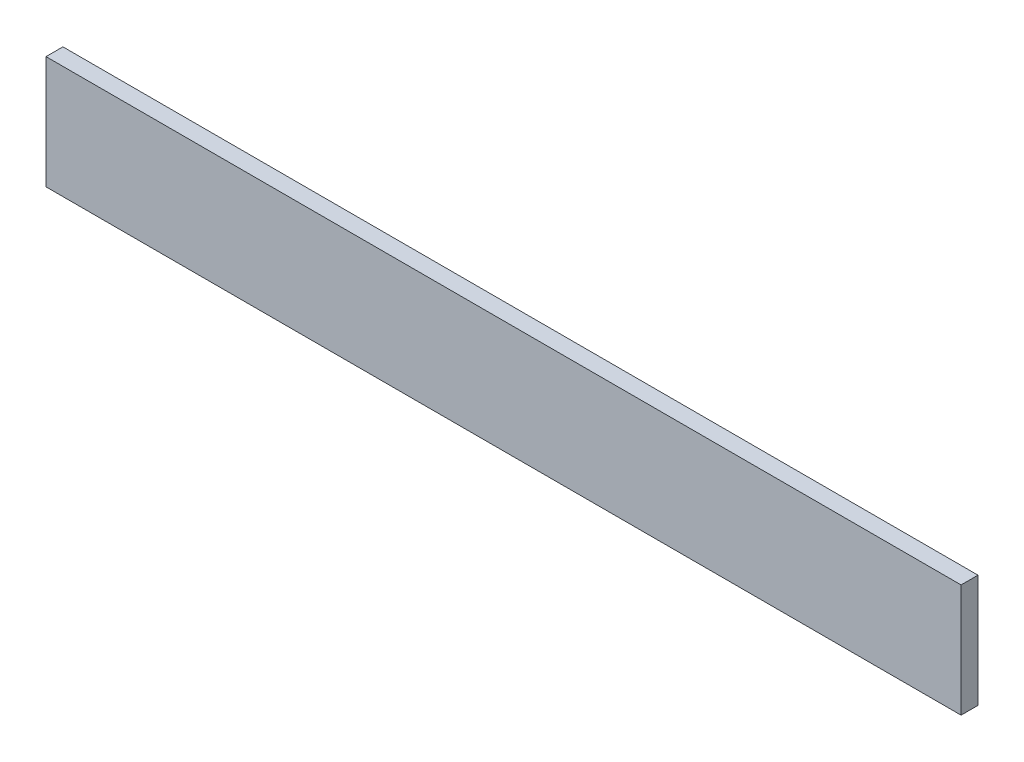
ISO-10303-21;
HEADER;
FILE_DESCRIPTION(('STEP AP214'),'2;1');
FILE_NAME('part.step','',(''),(''),'','','');
FILE_SCHEMA(('AUTOMOTIVE_DESIGN { 1 0 10303 214 1 1 1 1 }'));
ENDSEC;
DATA;
#1=APPLICATION_CONTEXT('core data for automotive mechanical design processes');
#2=APPLICATION_PROTOCOL_DEFINITION('international standard','automotive_design',2000,#1);
#3=PRODUCT_CONTEXT('',#1,'mechanical');
#4=PRODUCT('Part','Part','',(#3));
#5=PRODUCT_RELATED_PRODUCT_CATEGORY('part','',(#4));
#6=PRODUCT_DEFINITION_FORMATION('','',#4);
#7=PRODUCT_DEFINITION_CONTEXT('part definition',#1,'design');
#8=PRODUCT_DEFINITION('design','',#6,#7);
#9=PRODUCT_DEFINITION_SHAPE('','',#8);
#10=(LENGTH_UNIT() NAMED_UNIT(*) SI_UNIT(.MILLI.,.METRE.));
#11=(NAMED_UNIT(*) PLANE_ANGLE_UNIT() SI_UNIT($,.RADIAN.));
#12=(NAMED_UNIT(*) SI_UNIT($,.STERADIAN.) SOLID_ANGLE_UNIT());
#13=UNCERTAINTY_MEASURE_WITH_UNIT(LENGTH_MEASURE(1.E-05),#10,'distance_accuracy_value','');
#14=(GEOMETRIC_REPRESENTATION_CONTEXT(3) GLOBAL_UNCERTAINTY_ASSIGNED_CONTEXT((#13)) GLOBAL_UNIT_ASSIGNED_CONTEXT((#10,
#11,#12)) REPRESENTATION_CONTEXT('',''));
#15=CARTESIAN_POINT('',(0.,0.,0.));
#16=DIRECTION('',(0.,0.,1.));
#17=DIRECTION('',(1.,0.,0.));
#18=AXIS2_PLACEMENT_3D('',#15,#16,#17);
#19=CARTESIAN_POINT('',(405.6,-50.,15.));
#20=DIRECTION('',(-1.,0.,0.));
#21=DIRECTION('',(0.,0.,1.));
#22=AXIS2_PLACEMENT_3D('',#19,#20,#21);
#23=PLANE('',#22);
#24=DIRECTION('',(0.,1.,0.));
#25=VECTOR('',#24,1.);
#26=CARTESIAN_POINT('',(405.6,-50.,0.));
#27=LINE('',#26,#25);
#28=CARTESIAN_POINT('',(405.6,-50.,0.));
#29=VERTEX_POINT('',#28);
#30=CARTESIAN_POINT('',(405.6,50.,0.));
#31=VERTEX_POINT('',#30);
#32=EDGE_CURVE('E96',#29,#31,#27,.T.);
#33=ORIENTED_EDGE('',*,*,#32,.T.);
#34=DIRECTION('',(0.,0.,-1.));
#35=VECTOR('',#34,1.);
#36=CARTESIAN_POINT('',(405.6,50.,15.));
#37=LINE('',#36,#35);
#38=CARTESIAN_POINT('',(405.6,50.,15.));
#39=VERTEX_POINT('',#38);
#40=EDGE_CURVE('E11',#39,#31,#37,.T.);
#41=ORIENTED_EDGE('',*,*,#40,.F.);
#42=DIRECTION('',(0.,1.,0.));
#43=VECTOR('',#42,1.);
#44=CARTESIAN_POINT('',(405.6,-50.,15.));
#45=LINE('',#44,#43);
#46=CARTESIAN_POINT('',(405.6,-50.,15.));
#47=VERTEX_POINT('',#46);
#48=EDGE_CURVE('E84',#47,#39,#45,.T.);
#49=ORIENTED_EDGE('',*,*,#48,.F.);
#50=DIRECTION('',(0.,0.,-1.));
#51=VECTOR('',#50,1.);
#52=CARTESIAN_POINT('',(405.6,-50.,15.));
#53=LINE('',#52,#51);
#54=EDGE_CURVE('E92',#47,#29,#53,.T.);
#55=ORIENTED_EDGE('',*,*,#54,.T.);
#56=EDGE_LOOP('',(#33,#41,#49,#55));
#57=FACE_BOUND('',#56,.T.);
#58=ADVANCED_FACE('F33',(#57),#23,.F.);
#59=CARTESIAN_POINT('',(-405.6,50.,15.));
#60=DIRECTION('',(0.,-1.,0.));
#61=DIRECTION('',(0.,0.,-1.));
#62=AXIS2_PLACEMENT_3D('',#59,#60,#61);
#63=PLANE('',#62);
#64=DIRECTION('',(-1.,0.,0.));
#65=VECTOR('',#64,1.);
#66=CARTESIAN_POINT('',(-405.6,50.,0.));
#67=LINE('',#66,#65);
#68=CARTESIAN_POINT('',(-405.6,50.,0.));
#69=VERTEX_POINT('',#68);
#70=EDGE_CURVE('E88',#31,#69,#67,.T.);
#71=ORIENTED_EDGE('',*,*,#70,.T.);
#72=DIRECTION('',(0.,0.,-1.));
#73=VECTOR('',#72,1.);
#74=CARTESIAN_POINT('',(-405.6,50.,15.));
#75=LINE('',#74,#73);
#76=CARTESIAN_POINT('',(-405.6,50.,15.));
#77=VERTEX_POINT('',#76);
#78=EDGE_CURVE('E41',#77,#69,#75,.T.);
#79=ORIENTED_EDGE('',*,*,#78,.F.);
#80=DIRECTION('',(-1.,0.,0.));
#81=VECTOR('',#80,1.);
#82=CARTESIAN_POINT('',(-405.6,50.,15.));
#83=LINE('',#82,#81);
#84=EDGE_CURVE('E79',#39,#77,#83,.T.);
#85=ORIENTED_EDGE('',*,*,#84,.F.);
#86=ORIENTED_EDGE('',*,*,#40,.T.);
#87=EDGE_LOOP('',(#71,#79,#85,#86));
#88=FACE_BOUND('',#87,.T.);
#89=ADVANCED_FACE('F87',(#88),#63,.F.);
#90=CARTESIAN_POINT('',(-405.6,-50.,15.));
#91=DIRECTION('',(1.,0.,0.));
#92=DIRECTION('',(0.,0.,-1.));
#93=AXIS2_PLACEMENT_3D('',#90,#91,#92);
#94=PLANE('',#93);
#95=DIRECTION('',(0.,-1.,0.));
#96=VECTOR('',#95,1.);
#97=CARTESIAN_POINT('',(-405.6,-50.,0.));
#98=LINE('',#97,#96);
#99=CARTESIAN_POINT('',(-405.6,-50.,0.));
#100=VERTEX_POINT('',#99);
#101=EDGE_CURVE('E66',#69,#100,#98,.T.);
#102=ORIENTED_EDGE('',*,*,#101,.T.);
#103=DIRECTION('',(0.,0.,-1.));
#104=VECTOR('',#103,1.);
#105=CARTESIAN_POINT('',(-405.6,-50.,15.));
#106=LINE('',#105,#104);
#107=CARTESIAN_POINT('',(-405.6,-50.,15.));
#108=VERTEX_POINT('',#107);
#109=EDGE_CURVE('E89',#108,#100,#106,.T.);
#110=ORIENTED_EDGE('',*,*,#109,.F.);
#111=DIRECTION('',(0.,-1.,0.));
#112=VECTOR('',#111,1.);
#113=CARTESIAN_POINT('',(-405.6,-50.,15.));
#114=LINE('',#113,#112);
#115=EDGE_CURVE('E82',#77,#108,#114,.T.);
#116=ORIENTED_EDGE('',*,*,#115,.F.);
#117=ORIENTED_EDGE('',*,*,#78,.T.);
#118=EDGE_LOOP('',(#102,#110,#116,#117));
#119=FACE_BOUND('',#118,.T.);
#120=ADVANCED_FACE('F90',(#119),#94,.F.);
#121=CARTESIAN_POINT('',(-405.6,-50.,15.));
#122=DIRECTION('',(0.,1.,0.));
#123=DIRECTION('',(0.,0.,1.));
#124=AXIS2_PLACEMENT_3D('',#121,#122,#123);
#125=PLANE('',#124);
#126=DIRECTION('',(1.,0.,0.));
#127=VECTOR('',#126,1.);
#128=CARTESIAN_POINT('',(-405.6,-50.,0.));
#129=LINE('',#128,#127);
#130=EDGE_CURVE('E72',#100,#29,#129,.T.);
#131=ORIENTED_EDGE('',*,*,#130,.T.);
#132=ORIENTED_EDGE('',*,*,#54,.F.);
#133=DIRECTION('',(1.,0.,0.));
#134=VECTOR('',#133,1.);
#135=CARTESIAN_POINT('',(-405.6,-50.,15.));
#136=LINE('',#135,#134);
#137=EDGE_CURVE('E49',#108,#47,#136,.T.);
#138=ORIENTED_EDGE('',*,*,#137,.F.);
#139=ORIENTED_EDGE('',*,*,#109,.T.);
#140=EDGE_LOOP('',(#131,#132,#138,#139));
#141=FACE_BOUND('',#140,.T.);
#142=ADVANCED_FACE('F103',(#141),#125,.F.);
#143=CARTESIAN_POINT('',(0.,0.,15.));
#144=DIRECTION('',(0.,0.,-1.));
#145=DIRECTION('',(-1.,0.,0.));
#146=AXIS2_PLACEMENT_3D('',#143,#144,#145);
#147=PLANE('',#146);
#148=ORIENTED_EDGE('',*,*,#48,.T.);
#149=ORIENTED_EDGE('',*,*,#84,.T.);
#150=ORIENTED_EDGE('',*,*,#115,.T.);
#151=ORIENTED_EDGE('',*,*,#137,.T.);
#152=EDGE_LOOP('',(#148,#149,#150,#151));
#153=FACE_BOUND('',#152,.T.);
#154=ADVANCED_FACE('F80',(#153),#147,.F.);
#155=CARTESIAN_POINT('',(0.,0.,0.));
#156=DIRECTION('',(0.,0.,-1.));
#157=DIRECTION('',(-1.,0.,0.));
#158=AXIS2_PLACEMENT_3D('',#155,#156,#157);
#159=PLANE('',#158);
#160=ORIENTED_EDGE('',*,*,#32,.F.);
#161=ORIENTED_EDGE('',*,*,#130,.F.);
#162=ORIENTED_EDGE('',*,*,#101,.F.);
#163=ORIENTED_EDGE('',*,*,#70,.F.);
#164=EDGE_LOOP('',(#160,#161,#162,#163));
#165=FACE_BOUND('',#164,.T.);
#166=ADVANCED_FACE('F106',(#165),#159,.T.);
#167=CLOSED_SHELL('',(#58,#89,#120,#142,#154,#166));
#168=MANIFOLD_SOLID_BREP('B2',#167);
#169=ADVANCED_BREP_SHAPE_REPRESENTATION('',(#18,#168),#14);
#170=SHAPE_DEFINITION_REPRESENTATION(#9,#169);
ENDSEC;
END-ISO-10303-21;
